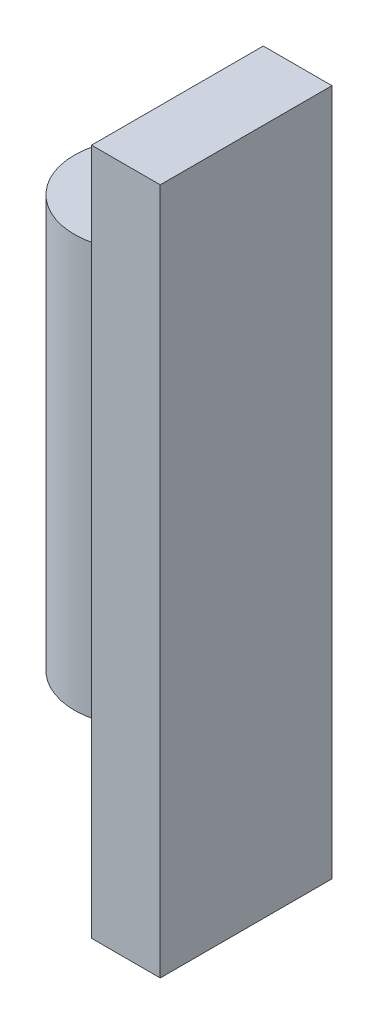
ISO-10303-21;
HEADER;
FILE_DESCRIPTION(('STEP AP214'),'2;1');
FILE_NAME('part.step','',(''),(''),'','','');
FILE_SCHEMA(('AUTOMOTIVE_DESIGN { 1 0 10303 214 1 1 1 1 }'));
ENDSEC;
DATA;
#1=APPLICATION_CONTEXT('core data for automotive mechanical design processes');
#2=APPLICATION_PROTOCOL_DEFINITION('international standard','automotive_design',2000,#1);
#3=PRODUCT_CONTEXT('',#1,'mechanical');
#4=PRODUCT('Part','Part','',(#3));
#5=PRODUCT_RELATED_PRODUCT_CATEGORY('part','',(#4));
#6=PRODUCT_DEFINITION_FORMATION('','',#4);
#7=PRODUCT_DEFINITION_CONTEXT('part definition',#1,'design');
#8=PRODUCT_DEFINITION('design','',#6,#7);
#9=PRODUCT_DEFINITION_SHAPE('','',#8);
#10=(LENGTH_UNIT() NAMED_UNIT(*) SI_UNIT(.MILLI.,.METRE.));
#11=(NAMED_UNIT(*) PLANE_ANGLE_UNIT() SI_UNIT($,.RADIAN.));
#12=(NAMED_UNIT(*) SI_UNIT($,.STERADIAN.) SOLID_ANGLE_UNIT());
#13=UNCERTAINTY_MEASURE_WITH_UNIT(LENGTH_MEASURE(1.E-05),#10,'distance_accuracy_value','');
#14=(GEOMETRIC_REPRESENTATION_CONTEXT(3) GLOBAL_UNCERTAINTY_ASSIGNED_CONTEXT((#13)) GLOBAL_UNIT_ASSIGNED_CONTEXT((#10,
#11,#12)) REPRESENTATION_CONTEXT('',''));
#15=CARTESIAN_POINT('',(0.,0.,0.));
#16=DIRECTION('',(0.,0.,1.));
#17=DIRECTION('',(1.,0.,0.));
#18=AXIS2_PLACEMENT_3D('',#15,#16,#17);
#19=CARTESIAN_POINT('',(-988.231317194732,0.,129.040934728822));
#20=DIRECTION('',(-1.,0.,0.));
#21=DIRECTION('',(0.,0.,-1.));
#22=AXIS2_PLACEMENT_3D('',#19,#20,#21);
#23=PLANE('',#22);
#24=DIRECTION('',(0.,0.,1.));
#25=VECTOR('',#24,1.);
#26=CARTESIAN_POINT('',(-988.231317194732,25.9999999999999,4.52046736441108));
#27=LINE('',#26,#25);
#28=CARTESIAN_POINT('',(-988.231317194732,25.9999999999999,4.52046736441108));
#29=VERTEX_POINT('',#28);
#30=CARTESIAN_POINT('',(-988.231317194732,25.9999999999999,9.52046736441109));
#31=VERTEX_POINT('',#30);
#32=EDGE_CURVE('E116',#29,#31,#27,.T.);
#33=ORIENTED_EDGE('',*,*,#32,.F.);
#34=DIRECTION('',(0.,1.,0.));
#35=VECTOR('',#34,1.);
#36=CARTESIAN_POINT('',(-988.231317194732,5.99999999999989,4.52046736441108));
#37=LINE('',#36,#35);
#38=CARTESIAN_POINT('',(-988.231317194732,5.99999999999989,4.52046736441108));
#39=VERTEX_POINT('',#38);
#40=EDGE_CURVE('E113',#39,#29,#37,.T.);
#41=ORIENTED_EDGE('',*,*,#40,.F.);
#42=DIRECTION('',(0.,0.,-1.));
#43=VECTOR('',#42,1.);
#44=CARTESIAN_POINT('',(-988.231317194732,5.99999999999989,9.52046736441109));
#45=LINE('',#44,#43);
#46=CARTESIAN_POINT('',(-988.231317194732,5.99999999999989,9.52046736441109));
#47=VERTEX_POINT('',#46);
#48=EDGE_CURVE('E128',#47,#39,#45,.T.);
#49=ORIENTED_EDGE('',*,*,#48,.F.);
#50=DIRECTION('',(0.,-1.,0.));
#51=VECTOR('',#50,1.);
#52=CARTESIAN_POINT('',(-988.231317194732,25.9999999999999,9.52046736441109));
#53=LINE('',#52,#51);
#54=EDGE_CURVE('E131',#31,#47,#53,.T.);
#55=ORIENTED_EDGE('',*,*,#54,.F.);
#56=EDGE_LOOP('',(#33,#41,#49,#55));
#57=FACE_BOUND('',#56,.T.);
#58=DIRECTION('',(0.,1.,0.));
#59=VECTOR('',#58,1.);
#60=CARTESIAN_POINT('',(-988.231317194732,10.9999999999999,5.28841655684222));
#61=LINE('',#60,#59);
#62=CARTESIAN_POINT('',(-988.231317194732,10.9999999999999,5.28841655684222));
#63=VERTEX_POINT('',#62);
#64=CARTESIAN_POINT('',(-988.231317194732,22.9999999999999,5.28841655684222));
#65=VERTEX_POINT('',#64);
#66=EDGE_CURVE('E46',#63,#65,#61,.T.);
#67=ORIENTED_EDGE('',*,*,#66,.T.);
#68=DIRECTION('',(0.,0.,1.));
#69=VECTOR('',#68,1.);
#70=CARTESIAN_POINT('',(-988.231317194732,22.9999999999999,129.040934728822));
#71=LINE('',#70,#69);
#72=CARTESIAN_POINT('',(-988.231317194732,22.9999999999999,8.75251817197996));
#73=VERTEX_POINT('',#72);
#74=EDGE_CURVE('E91',#65,#73,#71,.T.);
#75=ORIENTED_EDGE('',*,*,#74,.T.);
#76=DIRECTION('',(0.,1.,0.));
#77=VECTOR('',#76,1.);
#78=CARTESIAN_POINT('',(-988.231317194732,10.9999999999999,8.75251817197996));
#79=LINE('',#78,#77);
#80=CARTESIAN_POINT('',(-988.231317194732,10.9999999999999,8.75251817197996));
#81=VERTEX_POINT('',#80);
#82=EDGE_CURVE('E95',#73,#81,#79,.F.);
#83=ORIENTED_EDGE('',*,*,#82,.T.);
#84=DIRECTION('',(0.,0.,1.));
#85=VECTOR('',#84,1.);
#86=CARTESIAN_POINT('',(-988.231317194732,10.9999999999999,129.040934728822));
#87=LINE('',#86,#85);
#88=EDGE_CURVE('E11',#63,#81,#87,.T.);
#89=ORIENTED_EDGE('',*,*,#88,.F.);
#90=EDGE_LOOP('',(#67,#75,#83,#89));
#91=FACE_BOUND('',#90,.T.);
#92=ADVANCED_FACE('F38',(#57,#91),#23,.T.);
#93=CARTESIAN_POINT('',(-988.231317194732,25.9999999999999,4.52046736441108));
#94=DIRECTION('',(0.,-1.,0.));
#95=DIRECTION('',(0.,0.,1.));
#96=AXIS2_PLACEMENT_3D('',#93,#94,#95);
#97=PLANE('',#96);
#98=DIRECTION('',(0.,0.,1.));
#99=VECTOR('',#98,1.);
#100=CARTESIAN_POINT('',(-986.231317194732,25.9999999999999,4.52046736441108));
#101=LINE('',#100,#99);
#102=CARTESIAN_POINT('',(-986.231317194732,25.9999999999999,4.52046736441108));
#103=VERTEX_POINT('',#102);
#104=CARTESIAN_POINT('',(-986.231317194732,25.9999999999999,9.52046736441109));
#105=VERTEX_POINT('',#104);
#106=EDGE_CURVE('E123',#103,#105,#101,.T.);
#107=ORIENTED_EDGE('',*,*,#106,.F.);
#108=DIRECTION('',(1.,0.,0.));
#109=VECTOR('',#108,1.);
#110=CARTESIAN_POINT('',(-988.231317194732,25.9999999999999,4.52046736441108));
#111=LINE('',#110,#109);
#112=EDGE_CURVE('E110',#29,#103,#111,.T.);
#113=ORIENTED_EDGE('',*,*,#112,.F.);
#114=ORIENTED_EDGE('',*,*,#32,.T.);
#115=DIRECTION('',(1.,0.,0.));
#116=VECTOR('',#115,1.);
#117=CARTESIAN_POINT('',(-988.231317194732,25.9999999999999,9.52046736441109));
#118=LINE('',#117,#116);
#119=EDGE_CURVE('E99',#31,#105,#118,.T.);
#120=ORIENTED_EDGE('',*,*,#119,.T.);
#121=EDGE_LOOP('',(#107,#113,#114,#120));
#122=FACE_BOUND('',#121,.T.);
#123=ADVANCED_FACE('F40',(#122),#97,.F.);
#124=CARTESIAN_POINT('',(-988.231317194732,25.9999999999999,9.52046736441109));
#125=DIRECTION('',(0.,0.,-1.));
#126=DIRECTION('',(1.,0.,0.));
#127=AXIS2_PLACEMENT_3D('',#124,#125,#126);
#128=PLANE('',#127);
#129=DIRECTION('',(0.,-1.,0.));
#130=VECTOR('',#129,1.);
#131=CARTESIAN_POINT('',(-986.231317194732,25.9999999999999,9.52046736441109));
#132=LINE('',#131,#130);
#133=CARTESIAN_POINT('',(-986.231317194732,5.99999999999989,9.52046736441109));
#134=VERTEX_POINT('',#133);
#135=EDGE_CURVE('E120',#105,#134,#132,.T.);
#136=ORIENTED_EDGE('',*,*,#135,.F.);
#137=ORIENTED_EDGE('',*,*,#119,.F.);
#138=ORIENTED_EDGE('',*,*,#54,.T.);
#139=DIRECTION('',(1.,0.,0.));
#140=VECTOR('',#139,1.);
#141=CARTESIAN_POINT('',(-988.231317194732,5.99999999999989,9.52046736441109));
#142=LINE('',#141,#140);
#143=EDGE_CURVE('E102',#47,#134,#142,.T.);
#144=ORIENTED_EDGE('',*,*,#143,.T.);
#145=EDGE_LOOP('',(#136,#137,#138,#144));
#146=FACE_BOUND('',#145,.T.);
#147=ADVANCED_FACE('F144',(#146),#128,.F.);
#148=CARTESIAN_POINT('',(-988.231317194732,5.99999999999989,9.52046736441109));
#149=DIRECTION('',(0.,1.,0.));
#150=DIRECTION('',(0.,0.,-1.));
#151=AXIS2_PLACEMENT_3D('',#148,#149,#150);
#152=PLANE('',#151);
#153=DIRECTION('',(0.,0.,-1.));
#154=VECTOR('',#153,1.);
#155=CARTESIAN_POINT('',(-986.231317194732,5.99999999999989,9.52046736441109));
#156=LINE('',#155,#154);
#157=CARTESIAN_POINT('',(-986.231317194732,5.99999999999989,4.52046736441108));
#158=VERTEX_POINT('',#157);
#159=EDGE_CURVE('E117',#134,#158,#156,.T.);
#160=ORIENTED_EDGE('',*,*,#159,.F.);
#161=ORIENTED_EDGE('',*,*,#143,.F.);
#162=ORIENTED_EDGE('',*,*,#48,.T.);
#163=DIRECTION('',(1.,0.,0.));
#164=VECTOR('',#163,1.);
#165=CARTESIAN_POINT('',(-988.231317194732,5.99999999999989,4.52046736441108));
#166=LINE('',#165,#164);
#167=EDGE_CURVE('E107',#39,#158,#166,.T.);
#168=ORIENTED_EDGE('',*,*,#167,.T.);
#169=EDGE_LOOP('',(#160,#161,#162,#168));
#170=FACE_BOUND('',#169,.T.);
#171=ADVANCED_FACE('F150',(#170),#152,.F.);
#172=CARTESIAN_POINT('',(-988.231317194732,5.99999999999989,4.52046736441108));
#173=DIRECTION('',(0.,0.,1.));
#174=DIRECTION('',(-1.,0.,0.));
#175=AXIS2_PLACEMENT_3D('',#172,#173,#174);
#176=PLANE('',#175);
#177=DIRECTION('',(0.,1.,0.));
#178=VECTOR('',#177,1.);
#179=CARTESIAN_POINT('',(-986.231317194732,5.99999999999989,4.52046736441108));
#180=LINE('',#179,#178);
#181=EDGE_CURVE('E114',#158,#103,#180,.T.);
#182=ORIENTED_EDGE('',*,*,#181,.F.);
#183=ORIENTED_EDGE('',*,*,#167,.F.);
#184=ORIENTED_EDGE('',*,*,#40,.T.);
#185=ORIENTED_EDGE('',*,*,#112,.T.);
#186=EDGE_LOOP('',(#182,#183,#184,#185));
#187=FACE_BOUND('',#186,.T.);
#188=ADVANCED_FACE('F148',(#187),#176,.F.);
#189=CARTESIAN_POINT('',(-986.231317194732,0.,129.040934728822));
#190=DIRECTION('',(-1.,0.,0.));
#191=DIRECTION('',(0.,0.,-1.));
#192=AXIS2_PLACEMENT_3D('',#189,#190,#191);
#193=PLANE('',#192);
#194=ORIENTED_EDGE('',*,*,#106,.T.);
#195=ORIENTED_EDGE('',*,*,#135,.T.);
#196=ORIENTED_EDGE('',*,*,#159,.T.);
#197=ORIENTED_EDGE('',*,*,#181,.T.);
#198=EDGE_LOOP('',(#194,#195,#196,#197));
#199=FACE_BOUND('',#198,.T.);
#200=ADVANCED_FACE('F146',(#199),#193,.F.);
#201=CARTESIAN_POINT('',(-989.231317194732,10.9999999999999,7.02046736441109));
#202=DIRECTION('',(0.,1.,0.));
#203=DIRECTION('',(0.,0.,-1.));
#204=AXIS2_PLACEMENT_3D('',#201,#202,#203);
#205=CYLINDRICAL_SURFACE('',#204,2.);
#206=CARTESIAN_POINT('',(-989.231317194732,10.9999999999999,7.02046736441109));
#207=DIRECTION('',(0.,-1.,0.));
#208=DIRECTION('',(0.,0.,-1.));
#209=AXIS2_PLACEMENT_3D('',#206,#207,#208);
#210=CIRCLE('',#209,2.);
#211=EDGE_CURVE('E51',#81,#63,#210,.T.);
#212=ORIENTED_EDGE('',*,*,#211,.F.);
#213=ORIENTED_EDGE('',*,*,#82,.F.);
#214=CARTESIAN_POINT('',(-989.231317194732,22.9999999999999,7.02046736441109));
#215=DIRECTION('',(0.,-1.,0.));
#216=DIRECTION('',(0.,0.,-1.));
#217=AXIS2_PLACEMENT_3D('',#214,#215,#216);
#218=CIRCLE('',#217,2.);
#219=EDGE_CURVE('E88',#73,#65,#218,.T.);
#220=ORIENTED_EDGE('',*,*,#219,.T.);
#221=ORIENTED_EDGE('',*,*,#66,.F.);
#222=EDGE_LOOP('',(#212,#213,#220,#221));
#223=FACE_BOUND('',#222,.T.);
#224=ADVANCED_FACE('F96',(#223),#205,.T.);
#225=CARTESIAN_POINT('',(-989.231317194732,10.9999999999999,7.02046736441109));
#226=DIRECTION('',(0.,1.,0.));
#227=DIRECTION('',(0.,0.,-1.));
#228=AXIS2_PLACEMENT_3D('',#225,#226,#227);
#229=PLANE('',#228);
#230=ORIENTED_EDGE('',*,*,#88,.T.);
#231=ORIENTED_EDGE('',*,*,#211,.T.);
#232=EDGE_LOOP('',(#230,#231));
#233=FACE_BOUND('',#232,.T.);
#234=ADVANCED_FACE('F170',(#233),#229,.F.);
#235=CARTESIAN_POINT('',(-989.231317194732,22.9999999999999,7.02046736441109));
#236=DIRECTION('',(0.,1.,0.));
#237=DIRECTION('',(0.,0.,-1.));
#238=AXIS2_PLACEMENT_3D('',#235,#236,#237);
#239=PLANE('',#238);
#240=ORIENTED_EDGE('',*,*,#219,.F.);
#241=ORIENTED_EDGE('',*,*,#74,.F.);
#242=EDGE_LOOP('',(#240,#241));
#243=FACE_BOUND('',#242,.T.);
#244=ADVANCED_FACE('F89',(#243),#239,.T.);
#245=CLOSED_SHELL('',(#92,#123,#147,#171,#188,#200,#224,#234,#244));
#246=MANIFOLD_SOLID_BREP('B2',#245);
#247=ADVANCED_BREP_SHAPE_REPRESENTATION('',(#18,#246),#14);
#248=SHAPE_DEFINITION_REPRESENTATION(#9,#247);
ENDSEC;
END-ISO-10303-21;
